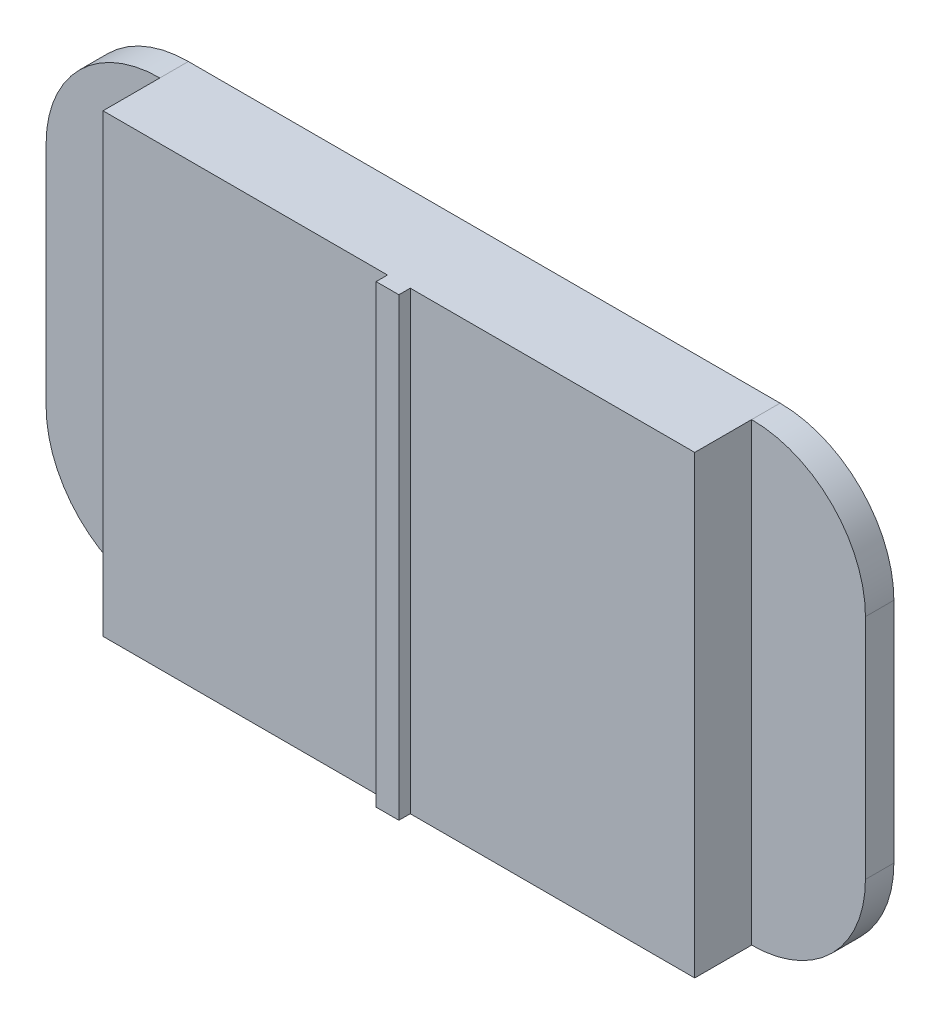
ISO-10303-21;
HEADER;
FILE_DESCRIPTION(('STEP AP214'),'2;1');
FILE_NAME('part.step','',(''),(''),'','','');
FILE_SCHEMA(('AUTOMOTIVE_DESIGN { 1 0 10303 214 1 1 1 1 }'));
ENDSEC;
DATA;
#1=APPLICATION_CONTEXT('core data for automotive mechanical design processes');
#2=APPLICATION_PROTOCOL_DEFINITION('international standard','automotive_design',2000,#1);
#3=PRODUCT_CONTEXT('',#1,'mechanical');
#4=PRODUCT('Part','Part','',(#3));
#5=PRODUCT_RELATED_PRODUCT_CATEGORY('part','',(#4));
#6=PRODUCT_DEFINITION_FORMATION('','',#4);
#7=PRODUCT_DEFINITION_CONTEXT('part definition',#1,'design');
#8=PRODUCT_DEFINITION('design','',#6,#7);
#9=PRODUCT_DEFINITION_SHAPE('','',#8);
#10=(LENGTH_UNIT() NAMED_UNIT(*) SI_UNIT(.MILLI.,.METRE.));
#11=(NAMED_UNIT(*) PLANE_ANGLE_UNIT() SI_UNIT($,.RADIAN.));
#12=(NAMED_UNIT(*) SI_UNIT($,.STERADIAN.) SOLID_ANGLE_UNIT());
#13=UNCERTAINTY_MEASURE_WITH_UNIT(LENGTH_MEASURE(1.E-05),#10,'distance_accuracy_value','');
#14=(GEOMETRIC_REPRESENTATION_CONTEXT(3) GLOBAL_UNCERTAINTY_ASSIGNED_CONTEXT((#13)) GLOBAL_UNIT_ASSIGNED_CONTEXT((#10,
#11,#12)) REPRESENTATION_CONTEXT('',''));
#15=CARTESIAN_POINT('',(0.,0.,0.));
#16=DIRECTION('',(0.,0.,1.));
#17=DIRECTION('',(1.,0.,0.));
#18=AXIS2_PLACEMENT_3D('',#15,#16,#17);
#19=CARTESIAN_POINT('',(26.,10.,0.));
#20=DIRECTION('',(0.,0.,-1.));
#21=DIRECTION('',(-1.,0.,0.));
#22=AXIS2_PLACEMENT_3D('',#19,#20,#21);
#23=CYLINDRICAL_SURFACE('',#22,10.);
#24=DIRECTION('',(0.,0.,1.));
#25=VECTOR('',#24,1.);
#26=CARTESIAN_POINT('',(26.,0.,0.));
#27=LINE('',#26,#25);
#28=CARTESIAN_POINT('',(26.,0.,7.02102803738318));
#29=VERTEX_POINT('',#28);
#30=CARTESIAN_POINT('',(26.,0.,9.52102803738317));
#31=VERTEX_POINT('',#30);
#32=EDGE_CURVE('E192',#29,#31,#27,.T.);
#33=ORIENTED_EDGE('',*,*,#32,.F.);
#34=CARTESIAN_POINT('',(26.,10.,7.02102803738318));
#35=DIRECTION('',(0.,0.,1.));
#36=DIRECTION('',(1.,0.,0.));
#37=AXIS2_PLACEMENT_3D('',#34,#35,#36);
#38=CIRCLE('',#37,10.);
#39=CARTESIAN_POINT('',(36.,10.,7.02102803738317));
#40=VERTEX_POINT('',#39);
#41=EDGE_CURVE('E41',#40,#29,#38,.F.);
#42=ORIENTED_EDGE('',*,*,#41,.F.);
#43=DIRECTION('',(0.,0.,1.));
#44=VECTOR('',#43,1.);
#45=CARTESIAN_POINT('',(36.,10.,0.));
#46=LINE('',#45,#44);
#47=CARTESIAN_POINT('',(36.,10.,9.52102803738317));
#48=VERTEX_POINT('',#47);
#49=EDGE_CURVE('E195',#48,#40,#46,.F.);
#50=ORIENTED_EDGE('',*,*,#49,.F.);
#51=CARTESIAN_POINT('',(26.,10.,9.52102803738318));
#52=DIRECTION('',(0.,0.,-1.));
#53=DIRECTION('',(-1.,0.,0.));
#54=AXIS2_PLACEMENT_3D('',#51,#52,#53);
#55=CIRCLE('',#54,10.);
#56=EDGE_CURVE('E11',#31,#48,#55,.F.);
#57=ORIENTED_EDGE('',*,*,#56,.F.);
#58=EDGE_LOOP('',(#33,#42,#50,#57));
#59=FACE_BOUND('',#58,.T.);
#60=ADVANCED_FACE('F34',(#59),#23,.T.);
#61=CARTESIAN_POINT('',(26.,30.,0.));
#62=DIRECTION('',(0.,0.,-1.));
#63=DIRECTION('',(-1.,0.,0.));
#64=AXIS2_PLACEMENT_3D('',#61,#62,#63);
#65=CYLINDRICAL_SURFACE('',#64,10.);
#66=DIRECTION('',(0.,0.,-1.));
#67=VECTOR('',#66,1.);
#68=CARTESIAN_POINT('',(26.,40.,0.));
#69=LINE('',#68,#67);
#70=CARTESIAN_POINT('',(26.,40.,9.52102803738317));
#71=VERTEX_POINT('',#70);
#72=CARTESIAN_POINT('',(26.,40.,7.02102803738317));
#73=VERTEX_POINT('',#72);
#74=EDGE_CURVE('E144',#71,#73,#69,.T.);
#75=ORIENTED_EDGE('',*,*,#74,.F.);
#76=CARTESIAN_POINT('',(26.,30.,9.52102803738318));
#77=DIRECTION('',(0.,0.,-1.));
#78=DIRECTION('',(-1.,0.,0.));
#79=AXIS2_PLACEMENT_3D('',#76,#77,#78);
#80=CIRCLE('',#79,10.);
#81=CARTESIAN_POINT('',(36.,30.,9.52102803738317));
#82=VERTEX_POINT('',#81);
#83=EDGE_CURVE('E129',#82,#71,#80,.F.);
#84=ORIENTED_EDGE('',*,*,#83,.F.);
#85=DIRECTION('',(0.,0.,-1.));
#86=VECTOR('',#85,1.);
#87=CARTESIAN_POINT('',(36.,30.,9.52102803738317));
#88=LINE('',#87,#86);
#89=CARTESIAN_POINT('',(36.,30.,7.02102803738317));
#90=VERTEX_POINT('',#89);
#91=EDGE_CURVE('E141',#90,#82,#88,.F.);
#92=ORIENTED_EDGE('',*,*,#91,.F.);
#93=CARTESIAN_POINT('',(26.,30.,7.02102803738318));
#94=DIRECTION('',(0.,0.,1.));
#95=DIRECTION('',(1.,0.,0.));
#96=AXIS2_PLACEMENT_3D('',#93,#94,#95);
#97=CIRCLE('',#96,10.);
#98=EDGE_CURVE('E140',#73,#90,#97,.F.);
#99=ORIENTED_EDGE('',*,*,#98,.F.);
#100=EDGE_LOOP('',(#75,#84,#92,#99));
#101=FACE_BOUND('',#100,.T.);
#102=ADVANCED_FACE('F146',(#101),#65,.T.);
#103=CARTESIAN_POINT('',(-26.,10.,9.52102803738317));
#104=DIRECTION('',(0.,0.,-1.));
#105=DIRECTION('',(-1.,0.,0.));
#106=AXIS2_PLACEMENT_3D('',#103,#104,#105);
#107=CYLINDRICAL_SURFACE('',#106,10.);
#108=DIRECTION('',(0.,0.,1.));
#109=VECTOR('',#108,1.);
#110=CARTESIAN_POINT('',(-36.,10.,9.52102803738317));
#111=LINE('',#110,#109);
#112=CARTESIAN_POINT('',(-36.,10.,7.02102803738317));
#113=VERTEX_POINT('',#112);
#114=CARTESIAN_POINT('',(-36.,10.,9.52102803738317));
#115=VERTEX_POINT('',#114);
#116=EDGE_CURVE('E181',#113,#115,#111,.T.);
#117=ORIENTED_EDGE('',*,*,#116,.F.);
#118=CARTESIAN_POINT('',(-26.,10.,7.02102803738317));
#119=DIRECTION('',(0.,0.,1.));
#120=DIRECTION('',(1.,0.,0.));
#121=AXIS2_PLACEMENT_3D('',#118,#119,#120);
#122=CIRCLE('',#121,10.);
#123=CARTESIAN_POINT('',(-26.,0.,7.02102803738317));
#124=VERTEX_POINT('',#123);
#125=EDGE_CURVE('E187',#124,#113,#122,.F.);
#126=ORIENTED_EDGE('',*,*,#125,.F.);
#127=DIRECTION('',(0.,0.,1.));
#128=VECTOR('',#127,1.);
#129=CARTESIAN_POINT('',(-26.,0.,9.52102803738317));
#130=LINE('',#129,#128);
#131=CARTESIAN_POINT('',(-26.,0.,9.52102803738317));
#132=VERTEX_POINT('',#131);
#133=EDGE_CURVE('E184',#132,#124,#130,.F.);
#134=ORIENTED_EDGE('',*,*,#133,.F.);
#135=CARTESIAN_POINT('',(-26.,10.,9.52102803738317));
#136=DIRECTION('',(0.,0.,-1.));
#137=DIRECTION('',(-1.,0.,0.));
#138=AXIS2_PLACEMENT_3D('',#135,#136,#137);
#139=CIRCLE('',#138,10.);
#140=EDGE_CURVE('E149',#115,#132,#139,.F.);
#141=ORIENTED_EDGE('',*,*,#140,.F.);
#142=EDGE_LOOP('',(#117,#126,#134,#141));
#143=FACE_BOUND('',#142,.T.);
#144=ADVANCED_FACE('F255',(#143),#107,.T.);
#145=CARTESIAN_POINT('',(-26.,30.,0.));
#146=DIRECTION('',(0.,0.,1.));
#147=DIRECTION('',(1.,0.,0.));
#148=AXIS2_PLACEMENT_3D('',#145,#146,#147);
#149=CYLINDRICAL_SURFACE('',#148,10.);
#150=DIRECTION('',(0.,0.,1.));
#151=VECTOR('',#150,1.);
#152=CARTESIAN_POINT('',(-26.,40.,0.));
#153=LINE('',#152,#151);
#154=CARTESIAN_POINT('',(-26.,40.,7.02102803738318));
#155=VERTEX_POINT('',#154);
#156=CARTESIAN_POINT('',(-26.,40.,9.52102803738317));
#157=VERTEX_POINT('',#156);
#158=EDGE_CURVE('E165',#155,#157,#153,.T.);
#159=ORIENTED_EDGE('',*,*,#158,.F.);
#160=CARTESIAN_POINT('',(-26.,30.,7.02102803738317));
#161=DIRECTION('',(0.,0.,1.));
#162=DIRECTION('',(1.,0.,0.));
#163=AXIS2_PLACEMENT_3D('',#160,#161,#162);
#164=CIRCLE('',#163,10.);
#165=CARTESIAN_POINT('',(-36.,30.,7.02102803738317));
#166=VERTEX_POINT('',#165);
#167=EDGE_CURVE('E176',#166,#155,#164,.F.);
#168=ORIENTED_EDGE('',*,*,#167,.F.);
#169=DIRECTION('',(0.,0.,1.));
#170=VECTOR('',#169,1.);
#171=CARTESIAN_POINT('',(-36.,30.,9.52102803738317));
#172=LINE('',#171,#170);
#173=CARTESIAN_POINT('',(-36.,30.,9.52102803738317));
#174=VERTEX_POINT('',#173);
#175=EDGE_CURVE('E168',#174,#166,#172,.F.);
#176=ORIENTED_EDGE('',*,*,#175,.F.);
#177=CARTESIAN_POINT('',(-26.,30.,9.52102803738317));
#178=DIRECTION('',(0.,0.,-1.));
#179=DIRECTION('',(-1.,0.,0.));
#180=AXIS2_PLACEMENT_3D('',#177,#178,#179);
#181=CIRCLE('',#180,10.);
#182=EDGE_CURVE('E179',#157,#174,#181,.F.);
#183=ORIENTED_EDGE('',*,*,#182,.F.);
#184=EDGE_LOOP('',(#159,#168,#176,#183));
#185=FACE_BOUND('',#184,.T.);
#186=ADVANCED_FACE('F261',(#185),#149,.T.);
#187=CARTESIAN_POINT('',(26.,40.,14.5210280373832));
#188=DIRECTION('',(-1.,0.,0.));
#189=DIRECTION('',(0.,0.,1.));
#190=AXIS2_PLACEMENT_3D('',#187,#188,#189);
#191=PLANE('',#190);
#192=DIRECTION('',(0.,0.,-1.));
#193=VECTOR('',#192,1.);
#194=CARTESIAN_POINT('',(26.,0.,14.5210280373832));
#195=LINE('',#194,#193);
#196=CARTESIAN_POINT('',(26.,0.,14.5210280373832));
#197=VERTEX_POINT('',#196);
#198=EDGE_CURVE('E164',#197,#31,#195,.T.);
#199=ORIENTED_EDGE('',*,*,#198,.T.);
#200=DIRECTION('',(0.,-1.,0.));
#201=VECTOR('',#200,1.);
#202=CARTESIAN_POINT('',(26.,40.,9.52102803738317));
#203=LINE('',#202,#201);
#204=EDGE_CURVE('E133',#71,#31,#203,.T.);
#205=ORIENTED_EDGE('',*,*,#204,.F.);
#206=DIRECTION('',(0.,0.,-1.));
#207=VECTOR('',#206,1.);
#208=CARTESIAN_POINT('',(26.,40.,14.5210280373832));
#209=LINE('',#208,#207);
#210=CARTESIAN_POINT('',(26.,40.,14.5210280373832));
#211=VERTEX_POINT('',#210);
#212=EDGE_CURVE('E152',#211,#71,#209,.T.);
#213=ORIENTED_EDGE('',*,*,#212,.F.);
#214=DIRECTION('',(0.,-1.,0.));
#215=VECTOR('',#214,1.);
#216=CARTESIAN_POINT('',(26.,40.,14.5210280373832));
#217=LINE('',#216,#215);
#218=EDGE_CURVE('E222',#211,#197,#217,.T.);
#219=ORIENTED_EDGE('',*,*,#218,.T.);
#220=EDGE_LOOP('',(#199,#205,#213,#219));
#221=FACE_BOUND('',#220,.T.);
#222=ADVANCED_FACE('F162',(#221),#191,.F.);
#223=CARTESIAN_POINT('',(32.,40.,9.52102803738317));
#224=DIRECTION('',(0.,0.,-1.));
#225=DIRECTION('',(-1.,0.,0.));
#226=AXIS2_PLACEMENT_3D('',#223,#224,#225);
#227=PLANE('',#226);
#228=ORIENTED_EDGE('',*,*,#204,.T.);
#229=ORIENTED_EDGE('',*,*,#56,.T.);
#230=DIRECTION('',(0.,-1.,0.));
#231=VECTOR('',#230,1.);
#232=CARTESIAN_POINT('',(36.,40.,9.52102803738317));
#233=LINE('',#232,#231);
#234=EDGE_CURVE('E136',#82,#48,#233,.T.);
#235=ORIENTED_EDGE('',*,*,#234,.F.);
#236=ORIENTED_EDGE('',*,*,#83,.T.);
#237=EDGE_LOOP('',(#228,#229,#235,#236));
#238=FACE_BOUND('',#237,.T.);
#239=ADVANCED_FACE('F131',(#238),#227,.F.);
#240=CARTESIAN_POINT('',(36.,40.,9.52102803738317));
#241=DIRECTION('',(-1.,0.,0.));
#242=DIRECTION('',(0.,0.,1.));
#243=AXIS2_PLACEMENT_3D('',#240,#241,#242);
#244=PLANE('',#243);
#245=ORIENTED_EDGE('',*,*,#234,.T.);
#246=ORIENTED_EDGE('',*,*,#49,.T.);
#247=DIRECTION('',(0.,-1.,0.));
#248=VECTOR('',#247,1.);
#249=CARTESIAN_POINT('',(36.,40.,7.02102803738317));
#250=LINE('',#249,#248);
#251=EDGE_CURVE('E170',#90,#40,#250,.T.);
#252=ORIENTED_EDGE('',*,*,#251,.F.);
#253=ORIENTED_EDGE('',*,*,#91,.T.);
#254=EDGE_LOOP('',(#245,#246,#252,#253));
#255=FACE_BOUND('',#254,.T.);
#256=ADVANCED_FACE('F322',(#255),#244,.F.);
#257=CARTESIAN_POINT('',(-36.,40.,7.02102803738317));
#258=DIRECTION('',(0.,0.,1.));
#259=DIRECTION('',(1.,0.,0.));
#260=AXIS2_PLACEMENT_3D('',#257,#258,#259);
#261=PLANE('',#260);
#262=ORIENTED_EDGE('',*,*,#251,.T.);
#263=ORIENTED_EDGE('',*,*,#41,.T.);
#264=DIRECTION('',(-1.,0.,0.));
#265=VECTOR('',#264,1.);
#266=CARTESIAN_POINT('',(-36.,0.,7.02102803738317));
#267=LINE('',#266,#265);
#268=EDGE_CURVE('E200',#29,#124,#267,.T.);
#269=ORIENTED_EDGE('',*,*,#268,.T.);
#270=ORIENTED_EDGE('',*,*,#125,.T.);
#271=DIRECTION('',(0.,-1.,0.));
#272=VECTOR('',#271,1.);
#273=CARTESIAN_POINT('',(-36.,40.,7.02102803738317));
#274=LINE('',#273,#272);
#275=EDGE_CURVE('E245',#166,#113,#274,.T.);
#276=ORIENTED_EDGE('',*,*,#275,.F.);
#277=ORIENTED_EDGE('',*,*,#167,.T.);
#278=DIRECTION('',(-1.,0.,0.));
#279=VECTOR('',#278,1.);
#280=CARTESIAN_POINT('',(0.999999999999997,40.,7.02102803738317));
#281=LINE('',#280,#279);
#282=EDGE_CURVE('E159',#73,#155,#281,.T.);
#283=ORIENTED_EDGE('',*,*,#282,.F.);
#284=ORIENTED_EDGE('',*,*,#98,.T.);
#285=EDGE_LOOP('',(#262,#263,#269,#270,#276,#277,#283,#284));
#286=FACE_BOUND('',#285,.T.);
#287=ADVANCED_FACE('F198',(#286),#261,.F.);
#288=CARTESIAN_POINT('',(-36.,40.,9.52102803738317));
#289=DIRECTION('',(1.,0.,0.));
#290=DIRECTION('',(0.,0.,-1.));
#291=AXIS2_PLACEMENT_3D('',#288,#289,#290);
#292=PLANE('',#291);
#293=ORIENTED_EDGE('',*,*,#275,.T.);
#294=ORIENTED_EDGE('',*,*,#116,.T.);
#295=DIRECTION('',(0.,-1.,0.));
#296=VECTOR('',#295,1.);
#297=CARTESIAN_POINT('',(-36.,40.,9.52102803738317));
#298=LINE('',#297,#296);
#299=EDGE_CURVE('E242',#174,#115,#298,.T.);
#300=ORIENTED_EDGE('',*,*,#299,.F.);
#301=ORIENTED_EDGE('',*,*,#175,.T.);
#302=EDGE_LOOP('',(#293,#294,#300,#301));
#303=FACE_BOUND('',#302,.T.);
#304=ADVANCED_FACE('F249',(#303),#292,.F.);
#305=CARTESIAN_POINT('',(-26.,40.,9.52102803738317));
#306=DIRECTION('',(0.,0.,-1.));
#307=DIRECTION('',(-1.,0.,0.));
#308=AXIS2_PLACEMENT_3D('',#305,#306,#307);
#309=PLANE('',#308);
#310=ORIENTED_EDGE('',*,*,#299,.T.);
#311=ORIENTED_EDGE('',*,*,#140,.T.);
#312=DIRECTION('',(0.,-1.,0.));
#313=VECTOR('',#312,1.);
#314=CARTESIAN_POINT('',(-26.,40.,9.52102803738317));
#315=LINE('',#314,#313);
#316=EDGE_CURVE('E239',#157,#132,#315,.T.);
#317=ORIENTED_EDGE('',*,*,#316,.F.);
#318=ORIENTED_EDGE('',*,*,#182,.T.);
#319=EDGE_LOOP('',(#310,#311,#317,#318));
#320=FACE_BOUND('',#319,.T.);
#321=ADVANCED_FACE('F258',(#320),#309,.F.);
#322=CARTESIAN_POINT('',(-26.,40.,14.5210280373832));
#323=DIRECTION('',(1.,0.,0.));
#324=DIRECTION('',(0.,0.,-1.));
#325=AXIS2_PLACEMENT_3D('',#322,#323,#324);
#326=PLANE('',#325);
#327=DIRECTION('',(0.,0.,1.));
#328=VECTOR('',#327,1.);
#329=CARTESIAN_POINT('',(-26.,0.,14.5210280373832));
#330=LINE('',#329,#328);
#331=CARTESIAN_POINT('',(-26.,0.,14.5210280373832));
#332=VERTEX_POINT('',#331);
#333=EDGE_CURVE('E207',#132,#332,#330,.T.);
#334=ORIENTED_EDGE('',*,*,#333,.T.);
#335=DIRECTION('',(0.,-1.,0.));
#336=VECTOR('',#335,1.);
#337=CARTESIAN_POINT('',(-26.,40.,14.5210280373832));
#338=LINE('',#337,#336);
#339=CARTESIAN_POINT('',(-26.,40.,14.5210280373832));
#340=VERTEX_POINT('',#339);
#341=EDGE_CURVE('E236',#340,#332,#338,.T.);
#342=ORIENTED_EDGE('',*,*,#341,.F.);
#343=DIRECTION('',(0.,0.,1.));
#344=VECTOR('',#343,1.);
#345=CARTESIAN_POINT('',(-26.,40.,14.5210280373832));
#346=LINE('',#345,#344);
#347=EDGE_CURVE('E262',#157,#340,#346,.T.);
#348=ORIENTED_EDGE('',*,*,#347,.F.);
#349=ORIENTED_EDGE('',*,*,#316,.T.);
#350=EDGE_LOOP('',(#334,#342,#348,#349));
#351=FACE_BOUND('',#350,.T.);
#352=ADVANCED_FACE('F298',(#351),#326,.F.);
#353=CARTESIAN_POINT('',(-0.999999999999994,40.,14.5210280373832));
#354=DIRECTION('',(0.,0.,-1.));
#355=DIRECTION('',(-1.,0.,0.));
#356=AXIS2_PLACEMENT_3D('',#353,#354,#355);
#357=PLANE('',#356);
#358=DIRECTION('',(1.,0.,0.));
#359=VECTOR('',#358,1.);
#360=CARTESIAN_POINT('',(-0.999999999999994,0.,14.5210280373832));
#361=LINE('',#360,#359);
#362=CARTESIAN_POINT('',(-0.999999999999994,0.,14.5210280373832));
#363=VERTEX_POINT('',#362);
#364=EDGE_CURVE('E209',#332,#363,#361,.T.);
#365=ORIENTED_EDGE('',*,*,#364,.T.);
#366=DIRECTION('',(0.,-1.,0.));
#367=VECTOR('',#366,1.);
#368=CARTESIAN_POINT('',(-0.999999999999994,40.,14.5210280373832));
#369=LINE('',#368,#367);
#370=CARTESIAN_POINT('',(-0.999999999999994,40.,14.5210280373832));
#371=VERTEX_POINT('',#370);
#372=EDGE_CURVE('E233',#371,#363,#369,.T.);
#373=ORIENTED_EDGE('',*,*,#372,.F.);
#374=DIRECTION('',(1.,0.,0.));
#375=VECTOR('',#374,1.);
#376=CARTESIAN_POINT('',(-0.999999999999994,40.,14.5210280373832));
#377=LINE('',#376,#375);
#378=EDGE_CURVE('E265',#340,#371,#377,.T.);
#379=ORIENTED_EDGE('',*,*,#378,.F.);
#380=ORIENTED_EDGE('',*,*,#341,.T.);
#381=EDGE_LOOP('',(#365,#373,#379,#380));
#382=FACE_BOUND('',#381,.T.);
#383=ADVANCED_FACE('F296',(#382),#357,.F.);
#384=CARTESIAN_POINT('',(-0.999999999999994,40.,15.5210280373832));
#385=DIRECTION('',(1.,0.,0.));
#386=DIRECTION('',(0.,0.,-1.));
#387=AXIS2_PLACEMENT_3D('',#384,#385,#386);
#388=PLANE('',#387);
#389=DIRECTION('',(0.,0.,1.));
#390=VECTOR('',#389,1.);
#391=CARTESIAN_POINT('',(-0.999999999999994,0.,15.5210280373832));
#392=LINE('',#391,#390);
#393=CARTESIAN_POINT('',(-0.999999999999994,0.,15.5210280373832));
#394=VERTEX_POINT('',#393);
#395=EDGE_CURVE('E215',#363,#394,#392,.T.);
#396=ORIENTED_EDGE('',*,*,#395,.T.);
#397=DIRECTION('',(0.,-1.,0.));
#398=VECTOR('',#397,1.);
#399=CARTESIAN_POINT('',(-0.999999999999994,40.,15.5210280373832));
#400=LINE('',#399,#398);
#401=CARTESIAN_POINT('',(-0.999999999999994,40.,15.5210280373832));
#402=VERTEX_POINT('',#401);
#403=EDGE_CURVE('E230',#402,#394,#400,.T.);
#404=ORIENTED_EDGE('',*,*,#403,.F.);
#405=DIRECTION('',(0.,0.,1.));
#406=VECTOR('',#405,1.);
#407=CARTESIAN_POINT('',(-0.999999999999994,40.,15.5210280373832));
#408=LINE('',#407,#406);
#409=EDGE_CURVE('E269',#371,#402,#408,.T.);
#410=ORIENTED_EDGE('',*,*,#409,.F.);
#411=ORIENTED_EDGE('',*,*,#372,.T.);
#412=EDGE_LOOP('',(#396,#404,#410,#411));
#413=FACE_BOUND('',#412,.T.);
#414=ADVANCED_FACE('F292',(#413),#388,.F.);
#415=CARTESIAN_POINT('',(0.999999999999998,40.,15.5210280373832));
#416=DIRECTION('',(0.,0.,-1.));
#417=DIRECTION('',(-1.,0.,0.));
#418=AXIS2_PLACEMENT_3D('',#415,#416,#417);
#419=PLANE('',#418);
#420=DIRECTION('',(1.,0.,0.));
#421=VECTOR('',#420,1.);
#422=CARTESIAN_POINT('',(0.999999999999998,0.,15.5210280373832));
#423=LINE('',#422,#421);
#424=CARTESIAN_POINT('',(0.999999999999998,0.,15.5210280373832));
#425=VERTEX_POINT('',#424);
#426=EDGE_CURVE('E217',#394,#425,#423,.T.);
#427=ORIENTED_EDGE('',*,*,#426,.T.);
#428=DIRECTION('',(0.,-1.,0.));
#429=VECTOR('',#428,1.);
#430=CARTESIAN_POINT('',(0.999999999999998,40.,15.5210280373832));
#431=LINE('',#430,#429);
#432=CARTESIAN_POINT('',(0.999999999999998,40.,15.5210280373832));
#433=VERTEX_POINT('',#432);
#434=EDGE_CURVE('E227',#433,#425,#431,.T.);
#435=ORIENTED_EDGE('',*,*,#434,.F.);
#436=DIRECTION('',(1.,0.,0.));
#437=VECTOR('',#436,1.);
#438=CARTESIAN_POINT('',(0.999999999999998,40.,15.5210280373832));
#439=LINE('',#438,#437);
#440=EDGE_CURVE('E271',#402,#433,#439,.T.);
#441=ORIENTED_EDGE('',*,*,#440,.F.);
#442=ORIENTED_EDGE('',*,*,#403,.T.);
#443=EDGE_LOOP('',(#427,#435,#441,#442));
#444=FACE_BOUND('',#443,.T.);
#445=ADVANCED_FACE('F288',(#444),#419,.F.);
#446=CARTESIAN_POINT('',(0.999999999999997,40.,14.5210280373832));
#447=DIRECTION('',(-1.,0.,0.));
#448=DIRECTION('',(0.,0.,1.));
#449=AXIS2_PLACEMENT_3D('',#446,#447,#448);
#450=PLANE('',#449);
#451=DIRECTION('',(0.,0.,-1.));
#452=VECTOR('',#451,1.);
#453=CARTESIAN_POINT('',(0.999999999999997,0.,14.5210280373832));
#454=LINE('',#453,#452);
#455=CARTESIAN_POINT('',(0.999999999999997,0.,14.5210280373832));
#456=VERTEX_POINT('',#455);
#457=EDGE_CURVE('E219',#425,#456,#454,.T.);
#458=ORIENTED_EDGE('',*,*,#457,.T.);
#459=DIRECTION('',(0.,-1.,0.));
#460=VECTOR('',#459,1.);
#461=CARTESIAN_POINT('',(0.999999999999997,40.,14.5210280373832));
#462=LINE('',#461,#460);
#463=CARTESIAN_POINT('',(0.999999999999997,40.,14.5210280373832));
#464=VERTEX_POINT('',#463);
#465=EDGE_CURVE('E224',#464,#456,#462,.T.);
#466=ORIENTED_EDGE('',*,*,#465,.F.);
#467=DIRECTION('',(0.,0.,-1.));
#468=VECTOR('',#467,1.);
#469=CARTESIAN_POINT('',(0.999999999999997,40.,14.5210280373832));
#470=LINE('',#469,#468);
#471=EDGE_CURVE('E273',#433,#464,#470,.T.);
#472=ORIENTED_EDGE('',*,*,#471,.F.);
#473=ORIENTED_EDGE('',*,*,#434,.T.);
#474=EDGE_LOOP('',(#458,#466,#472,#473));
#475=FACE_BOUND('',#474,.T.);
#476=ADVANCED_FACE('F279',(#475),#450,.F.);
#477=CARTESIAN_POINT('',(26.,40.,14.5210280373832));
#478=DIRECTION('',(0.,0.,-1.));
#479=DIRECTION('',(-1.,0.,0.));
#480=AXIS2_PLACEMENT_3D('',#477,#478,#479);
#481=PLANE('',#480);
#482=DIRECTION('',(1.,0.,0.));
#483=VECTOR('',#482,1.);
#484=CARTESIAN_POINT('',(26.,0.,14.5210280373832));
#485=LINE('',#484,#483);
#486=EDGE_CURVE('E160',#456,#197,#485,.T.);
#487=ORIENTED_EDGE('',*,*,#486,.T.);
#488=ORIENTED_EDGE('',*,*,#218,.F.);
#489=DIRECTION('',(1.,0.,0.));
#490=VECTOR('',#489,1.);
#491=CARTESIAN_POINT('',(26.,40.,14.5210280373832));
#492=LINE('',#491,#490);
#493=EDGE_CURVE('E155',#464,#211,#492,.T.);
#494=ORIENTED_EDGE('',*,*,#493,.F.);
#495=ORIENTED_EDGE('',*,*,#465,.T.);
#496=EDGE_LOOP('',(#487,#488,#494,#495));
#497=FACE_BOUND('',#496,.T.);
#498=ADVANCED_FACE('F283',(#497),#481,.F.);
#499=CARTESIAN_POINT('',(0.,40.,0.));
#500=DIRECTION('',(0.,-1.,0.));
#501=DIRECTION('',(0.,0.,-1.));
#502=AXIS2_PLACEMENT_3D('',#499,#500,#501);
#503=PLANE('',#502);
#504=ORIENTED_EDGE('',*,*,#212,.T.);
#505=ORIENTED_EDGE('',*,*,#74,.T.);
#506=ORIENTED_EDGE('',*,*,#282,.T.);
#507=ORIENTED_EDGE('',*,*,#158,.T.);
#508=ORIENTED_EDGE('',*,*,#347,.T.);
#509=ORIENTED_EDGE('',*,*,#378,.T.);
#510=ORIENTED_EDGE('',*,*,#409,.T.);
#511=ORIENTED_EDGE('',*,*,#440,.T.);
#512=ORIENTED_EDGE('',*,*,#471,.T.);
#513=ORIENTED_EDGE('',*,*,#493,.T.);
#514=EDGE_LOOP('',(#504,#505,#506,#507,#508,#509,#510,#511,#512,#513));
#515=FACE_BOUND('',#514,.T.);
#516=ADVANCED_FACE('F153',(#515),#503,.F.);
#517=CARTESIAN_POINT('',(0.,0.,0.));
#518=DIRECTION('',(0.,-1.,0.));
#519=DIRECTION('',(0.,0.,-1.));
#520=AXIS2_PLACEMENT_3D('',#517,#518,#519);
#521=PLANE('',#520);
#522=ORIENTED_EDGE('',*,*,#268,.F.);
#523=ORIENTED_EDGE('',*,*,#32,.T.);
#524=ORIENTED_EDGE('',*,*,#198,.F.);
#525=ORIENTED_EDGE('',*,*,#486,.F.);
#526=ORIENTED_EDGE('',*,*,#457,.F.);
#527=ORIENTED_EDGE('',*,*,#426,.F.);
#528=ORIENTED_EDGE('',*,*,#395,.F.);
#529=ORIENTED_EDGE('',*,*,#364,.F.);
#530=ORIENTED_EDGE('',*,*,#333,.F.);
#531=ORIENTED_EDGE('',*,*,#133,.T.);
#532=EDGE_LOOP('',(#522,#523,#524,#525,#526,#527,#528,#529,#530,#531));
#533=FACE_BOUND('',#532,.T.);
#534=ADVANCED_FACE('F204',(#533),#521,.T.);
#535=CLOSED_SHELL('',(#60,#102,#144,#186,#222,#239,#256,#287,#304,#321,#352,#383,#414,#445,#476,
#498,#516,#534));
#536=MANIFOLD_SOLID_BREP('B2',#535);
#537=ADVANCED_BREP_SHAPE_REPRESENTATION('',(#18,#536),#14);
#538=SHAPE_DEFINITION_REPRESENTATION(#9,#537);
ENDSEC;
END-ISO-10303-21;
